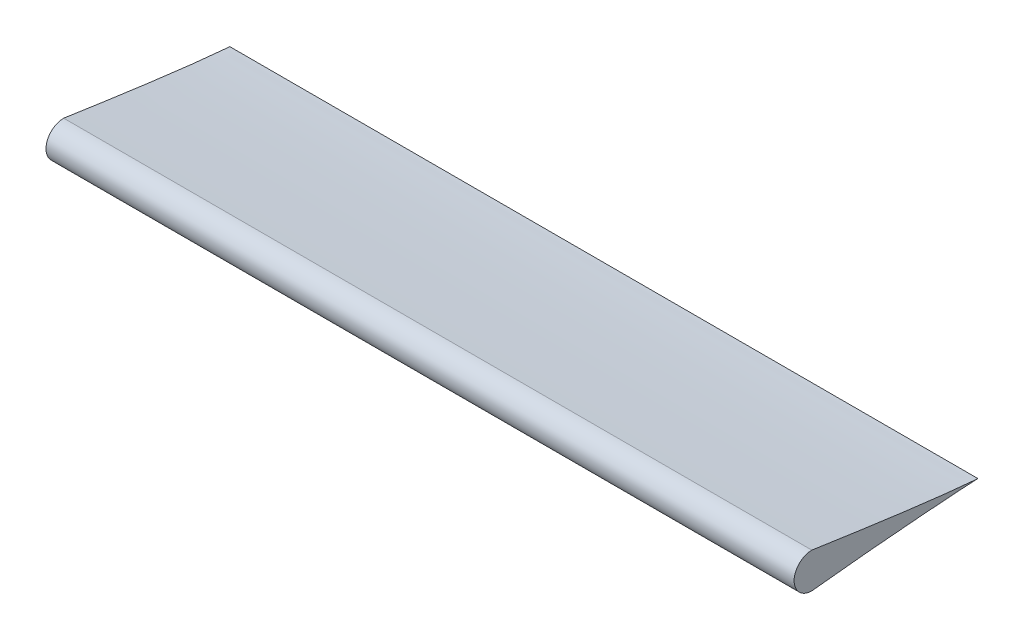
ISO-10303-21;
HEADER;
FILE_DESCRIPTION(('STEP AP214'),'2;1');
FILE_NAME('part.step','',(''),(''),'','','');
FILE_SCHEMA(('AUTOMOTIVE_DESIGN { 1 0 10303 214 1 1 1 1 }'));
ENDSEC;
DATA;
#1=APPLICATION_CONTEXT('core data for automotive mechanical design processes');
#2=APPLICATION_PROTOCOL_DEFINITION('international standard','automotive_design',2000,#1);
#3=PRODUCT_CONTEXT('',#1,'mechanical');
#4=PRODUCT('Part','Part','',(#3));
#5=PRODUCT_RELATED_PRODUCT_CATEGORY('part','',(#4));
#6=PRODUCT_DEFINITION_FORMATION('','',#4);
#7=PRODUCT_DEFINITION_CONTEXT('part definition',#1,'design');
#8=PRODUCT_DEFINITION('design','',#6,#7);
#9=PRODUCT_DEFINITION_SHAPE('','',#8);
#10=(LENGTH_UNIT() NAMED_UNIT(*) SI_UNIT(.MILLI.,.METRE.));
#11=(NAMED_UNIT(*) PLANE_ANGLE_UNIT() SI_UNIT($,.RADIAN.));
#12=(NAMED_UNIT(*) SI_UNIT($,.STERADIAN.) SOLID_ANGLE_UNIT());
#13=UNCERTAINTY_MEASURE_WITH_UNIT(LENGTH_MEASURE(1.E-05),#10,'distance_accuracy_value','');
#14=(GEOMETRIC_REPRESENTATION_CONTEXT(3) GLOBAL_UNCERTAINTY_ASSIGNED_CONTEXT((#13)) GLOBAL_UNIT_ASSIGNED_CONTEXT((#10,
#11,#12)) REPRESENTATION_CONTEXT('',''));
#15=CARTESIAN_POINT('',(0.,0.,0.));
#16=DIRECTION('',(0.,0.,1.));
#17=DIRECTION('',(1.,0.,0.));
#18=AXIS2_PLACEMENT_3D('',#15,#16,#17);
#19=CARTESIAN_POINT('',(1040.,5.86071638027729,-346.600000000002));
#20=CARTESIAN_POINT('',(1040.,5.86942153305407,-346.597852480933));
#21=CARTESIAN_POINT('',(1040.,5.95408700484373,-345.167167538133));
#22=CARTESIAN_POINT('',(1040.,6.12770380231326,-343.71030351356));
#23=CARTESIAN_POINT('',(1040.,6.4308186427241,-340.207816876405));
#24=CARTESIAN_POINT('',(1040.,6.87325921714055,-335.907670847587));
#25=CARTESIAN_POINT('',(1040.,7.49275086256784,-330.292953697324));
#26=CARTESIAN_POINT('',(1040.,8.27408445055139,-323.659553652556));
#27=CARTESIAN_POINT('',(1040.,9.24327014430082,-316.002511078225));
#28=CARTESIAN_POINT('',(1040.,10.3815705655345,-307.429551377501));
#29=CARTESIAN_POINT('',(1040.,11.6833030342218,-298.018680009203));
#30=CARTESIAN_POINT('',(1040.,13.1368804000073,-287.863702409179));
#31=CARTESIAN_POINT('',(1040.,14.7182033722859,-277.059643778127));
#32=CARTESIAN_POINT('',(1040.,16.4008254095122,-265.704765677718));
#33=CARTESIAN_POINT('',(1040.,18.1406788919493,-253.896097473474));
#34=CARTESIAN_POINT('',(1040.,19.9192377434932,-241.737250017814));
#35=CARTESIAN_POINT('',(1040.,21.6563318290564,-229.327440834419));
#36=CARTESIAN_POINT('',(1040.,23.3337080476178,-216.762528701424));
#37=CARTESIAN_POINT('',(1040.,24.7772271585557,-204.073884670746));
#38=CARTESIAN_POINT('',(1040.,25.9228413259878,-191.282522577714));
#39=CARTESIAN_POINT('',(1040.,26.8745966143026,-178.425425999593));
#40=CARTESIAN_POINT('',(1040.,27.5954369967736,-165.549012826765));
#41=CARTESIAN_POINT('',(1040.,28.088486879693,-152.725859519747));
#42=CARTESIAN_POINT('',(1040.,28.3788067662139,-140.023357060786));
#43=CARTESIAN_POINT('',(1040.,28.4385181896697,-127.510045631155));
#44=CARTESIAN_POINT('',(1040.,28.2957815085232,-115.254313713338));
#45=CARTESIAN_POINT('',(1040.,27.9345770933286,-103.323214561727));
#46=CARTESIAN_POINT('',(1040.,27.3774648805769,-91.7878334113468));
#47=CARTESIAN_POINT('',(1040.,26.6199481784094,-80.7121418120204));
#48=CARTESIAN_POINT('',(1040.,25.6837634702586,-70.1628154750461));
#49=CARTESIAN_POINT('',(1040.,24.5593112665133,-60.2034081504018));
#50=CARTESIAN_POINT('',(1040.,23.2663130962176,-50.8913221894429));
#51=CARTESIAN_POINT('',(1040.,21.7863228253272,-42.280845355484));
#52=CARTESIAN_POINT('',(1040.,20.1573279635737,-34.4120212721913));
#53=CARTESIAN_POINT('',(1040.,18.3357603863429,-27.3199916589574));
#54=CARTESIAN_POINT('',(1040.,16.321012042133,-21.0306334923619));
#55=CARTESIAN_POINT('',(1040.,14.2018530313748,-15.5314824382831));
#56=CARTESIAN_POINT('',(1040.,11.956924227719,-10.8536593210113));
#57=CARTESIAN_POINT('',(1040.,9.65350487933514,-7.00869240132422));
#58=CARTESIAN_POINT('',(1040.,7.32149117441311,-3.99127209384448));
#59=CARTESIAN_POINT('',(1040.,4.91734468115568,-1.82192325647609));
#60=CARTESIAN_POINT('',(1040.,2.58232434229011,-0.523442799864354));
#61=CARTESIAN_POINT('',(1040.,0.409759015467137,0.233627416068555));
#62=CARTESIAN_POINT('',(1040.,-1.75709273500441,-0.426579477063926));
#63=CARTESIAN_POINT('',(1040.,-3.19774833654451,-2.53791233705558));
#64=CARTESIAN_POINT('',(1040.,-4.65483807131872,-5.39211144626317));
#65=CARTESIAN_POINT('',(1040.,-6.05472613804292,-9.30647814844365));
#66=CARTESIAN_POINT('',(1040.,-7.37535584141202,-14.1602854101434));
#67=CARTESIAN_POINT('',(1040.,-8.59209450318427,-19.9552057462871));
#68=CARTESIAN_POINT('',(1040.,-9.67784910590047,-26.6510377888111));
#69=CARTESIAN_POINT('',(1040.,-10.6303869203227,-34.2149896306284));
#70=CARTESIAN_POINT('',(1040.,-11.4362358704925,-42.6095526598737));
#71=CARTESIAN_POINT('',(1040.,-12.0917115028124,-51.7866503013561));
#72=CARTESIAN_POINT('',(1040.,-12.6014398459628,-61.6964853282173));
#73=CARTESIAN_POINT('',(1040.,-12.9578854769251,-72.2808050911164));
#74=CARTESIAN_POINT('',(1040.,-13.1648826289751,-83.4794397444211));
#75=CARTESIAN_POINT('',(1040.,-13.2211833311955,-95.2244179207898));
#76=CARTESIAN_POINT('',(1040.,-13.132798440432,-107.445315636969));
#77=CARTESIAN_POINT('',(1040.,-12.9039422081063,-120.06718568759));
#78=CARTESIAN_POINT('',(1040.,-12.5386131752456,-133.010375763007));
#79=CARTESIAN_POINT('',(1040.,-12.0446708618454,-146.192016010977));
#80=CARTESIAN_POINT('',(1040.,-11.4143407457611,-159.52633158202));
#81=CARTESIAN_POINT('',(1040.,-10.6584041848465,-172.924472517881));
#82=CARTESIAN_POINT('',(1040.,-9.72862479746972,-186.316724917838));
#83=CARTESIAN_POINT('',(1040.,-8.59584787560963,-199.652839070497));
#84=CARTESIAN_POINT('',(1040.,-7.31292079951085,-212.898223931713));
#85=CARTESIAN_POINT('',(1040.,-5.91694220775768,-226.003657754342));
#86=CARTESIAN_POINT('',(1040.,-4.45292645217388,-238.897774799766));
#87=CARTESIAN_POINT('',(1040.,-2.98628782761956,-251.506843629765));
#88=CARTESIAN_POINT('',(1040.,-1.56237335714116,-263.735084655258));
#89=CARTESIAN_POINT('',(1040.,-0.237986920124444,-275.482068230199));
#90=CARTESIAN_POINT('',(1040.,0.967497871551481,-286.637141689727));
#91=CARTESIAN_POINT('',(1040.,2.03372814092395,-297.094147692606));
#92=CARTESIAN_POINT('',(1040.,2.94760216572376,-306.753882210194));
#93=CARTESIAN_POINT('',(1040.,3.71094189693194,-315.518201790493));
#94=CARTESIAN_POINT('',(1040.,4.33761076632516,-323.308156110828));
#95=CARTESIAN_POINT('',(1040.,4.82578782510334,-330.021729474099));
#96=CARTESIAN_POINT('',(1040.,5.21956178896954,-335.69003557838));
#97=CARTESIAN_POINT('',(1040.,5.55182594115478,-340.042163058898));
#98=CARTESIAN_POINT('',(1040.,5.75757542524663,-343.623905570646));
#99=CARTESIAN_POINT('',(1040.,5.87005572151078,-345.115045904188));
#100=CARTESIAN_POINT('',(1040.,5.85182687726851,-346.602192997381));
#101=CARTESIAN_POINT('',(1040.,5.86071638027729,-346.600000000002));
#102=B_SPLINE_CURVE_WITH_KNOTS('',3,(#19,#20,#21,#22,#23,#24,#25,#26,#27,#28,#29,#30,#31,#32,
#33,#34,#35,#36,#37,#38,#39,#40,#41,#42,#43,#44,#45,#46,#47,#48,#49,#50,#51,#52,#53,#54,#55,#56,
#57,#58,#59,#60,#61,#62,#63,#64,#65,#66,#67,#68,#69,#70,#71,#72,#73,#74,#75,#76,#77,#78,#79,#80,
#81,#82,#83,#84,#85,#86,#87,#88,#89,#90,#91,#92,#93,#94,#95,#96,#97,#98,#99,#100,#101),
.UNSPECIFIED.,.T.,.F.,(4,1,1,1,1,1,1,1,1,1,1,1,1,1,1,1,1,1,1,1,1,1,1,1,1,1,1,1,1,1,1,1,1,1,1,1,
1,1,1,1,1,1,1,1,1,1,1,1,1,1,1,1,1,1,1,1,1,1,1,1,1,1,1,1,1,1,1,1,1,1,1,1,1,1,1,1,1,1,1,1,4),(0.,
0.000971237958935089,0.00379550488941406,0.00838889713311412,0.0147108585341679,
0.0226780451151255,0.0321935893654122,0.0431578374772158,0.0554477635765267,0.0689450810748732,
0.0835209743295518,0.0990345049396833,0.115338149300278,0.132292378261073,0.149748787287016,
0.167548160817062,0.185533000847794,0.203606824322396,0.221802152219981,0.240094780419079,
0.258381325545334,0.276593840485898,0.294615696320151,0.312363136598153,0.329758285552068,
0.34668867666744,0.363076304230722,0.378823915995178,0.393853850968574,0.408070676422894,
0.421404123740081,0.433792847882556,0.445184773052429,0.455537591190034,0.464887425285465,
0.473229998593558,0.480557633281548,0.486906623799577,0.492238034051424,0.496718364977629,
0.500526341599145,0.503606091199367,0.506177592628953,0.509478573363382,0.514052138731787,
0.519911011985978,0.527046393100711,0.535434514860353,0.545049400456516,0.555862282514593,
0.56781964692456,0.58087606000333,0.594950040868561,0.609977749598367,0.625870112949949,
0.642537246695213,0.659878939874303,0.677794441934522,0.696172799529494,0.714892973853184,
0.733838964579521,0.752890035469179,0.771908418749841,0.790874705845988,0.809754599599678,
0.828447710464764,0.846871330730811,0.864890849052298,0.882382263972322,0.89917761398861,
0.915117479075331,0.930053399369896,0.943838005379903,0.956340240690094,0.967439356026097,
0.977019226998307,0.985009700423928,0.991382470548144,0.996091139759218,0.999008193999625,1.),.UNSPECIFIED.);
#103=DIRECTION('',(-1.,0.,0.));
#104=VECTOR('',#103,1.);
#105=SURFACE_OF_LINEAR_EXTRUSION('',#102,#104);
#106=DIRECTION('',(0.,1.,0.));
#107=VECTOR('',#106,1.);
#108=CARTESIAN_POINT('',(728.,-13.2211833311954,-346.600009514084));
#109=LINE('',#108,#107);
#110=CARTESIAN_POINT('',(728.,5.86063879772081,-346.600009514084));
#111=VERTEX_POINT('',#110);
#112=CARTESIAN_POINT('',(728.,5.86071638027724,-346.600009514084));
#113=VERTEX_POINT('',#112);
#114=EDGE_CURVE('E135',#111,#113,#109,.T.);
#115=ORIENTED_EDGE('',*,*,#114,.T.);
#116=CARTESIAN_POINT('',(728.,5.86071638027733,-346.600000000001));
#117=CARTESIAN_POINT('',(728.,5.86942153305412,-346.597852480932));
#118=CARTESIAN_POINT('',(728.,5.95408700484373,-345.167167538133));
#119=CARTESIAN_POINT('',(728.,6.12770380231326,-343.71030351356));
#120=CARTESIAN_POINT('',(728.,6.43081864272416,-340.207816876404));
#121=CARTESIAN_POINT('',(728.,6.87325921714066,-335.907670847587));
#122=CARTESIAN_POINT('',(728.,7.49275086256784,-330.292953697323));
#123=CARTESIAN_POINT('',(728.,8.27408445055139,-323.659553652556));
#124=CARTESIAN_POINT('',(728.,9.24327014430082,-316.002511078225));
#125=CARTESIAN_POINT('',(728.,10.3815705655344,-307.429551377501));
#126=CARTESIAN_POINT('',(728.,11.6833030342218,-298.018680009203));
#127=CARTESIAN_POINT('',(728.,13.1368804000073,-287.863702409179));
#128=CARTESIAN_POINT('',(728.,14.7182033722859,-277.059643778127));
#129=CARTESIAN_POINT('',(728.,16.4008254095121,-265.704765677719));
#130=CARTESIAN_POINT('',(728.,18.1406788919493,-253.896097473474));
#131=CARTESIAN_POINT('',(728.,19.9192377434932,-241.737250017814));
#132=CARTESIAN_POINT('',(728.,21.6563318290564,-229.327440834419));
#133=CARTESIAN_POINT('',(728.,23.3337080476178,-216.762528701424));
#134=CARTESIAN_POINT('',(728.,24.7772271585557,-204.073884670746));
#135=CARTESIAN_POINT('',(728.,25.9228413259878,-191.282522577713));
#136=CARTESIAN_POINT('',(728.,26.8745966143026,-178.425425999593));
#137=CARTESIAN_POINT('',(728.,27.5954369967736,-165.549012826765));
#138=CARTESIAN_POINT('',(728.,28.088486879693,-152.725859519747));
#139=CARTESIAN_POINT('',(728.,28.3788067662139,-140.023357060786));
#140=CARTESIAN_POINT('',(728.,28.4385181896697,-127.510045631155));
#141=CARTESIAN_POINT('',(728.,28.2957815085232,-115.254313713338));
#142=CARTESIAN_POINT('',(728.,27.9345770933285,-103.323214561727));
#143=CARTESIAN_POINT('',(728.,27.377464880577,-91.7878334113469));
#144=CARTESIAN_POINT('',(728.,26.6199481784094,-80.7121418120204));
#145=CARTESIAN_POINT('',(728.,25.6837634702586,-70.1628154750462));
#146=CARTESIAN_POINT('',(728.,24.5593112665133,-60.2034081504018));
#147=CARTESIAN_POINT('',(728.,23.2663130962177,-50.8913221894429));
#148=CARTESIAN_POINT('',(728.,21.7863228253272,-42.2808453554841));
#149=CARTESIAN_POINT('',(728.,20.1573279635737,-34.4120212721913));
#150=CARTESIAN_POINT('',(728.,18.3357603863429,-27.3199916589574));
#151=CARTESIAN_POINT('',(728.,16.321012042133,-21.030633492362));
#152=CARTESIAN_POINT('',(728.,14.2018530313748,-15.5314824382831));
#153=CARTESIAN_POINT('',(728.,11.956924227719,-10.8536593210112));
#154=CARTESIAN_POINT('',(728.,9.65350487933514,-7.00869240132423));
#155=CARTESIAN_POINT('',(728.,7.32149117441311,-3.99127209384453));
#156=CARTESIAN_POINT('',(728.,4.91734468115568,-1.82192325647618));
#157=CARTESIAN_POINT('',(728.,2.58232434229011,-0.523442799864188));
#158=CARTESIAN_POINT('',(728.,0.409759015467137,0.233627416068444));
#159=CARTESIAN_POINT('',(728.,-1.75709273500441,-0.42657947706401));
#160=CARTESIAN_POINT('',(728.,-3.19774833654451,-2.5379123370555));
#161=CARTESIAN_POINT('',(728.,-4.65483807131872,-5.39211144626328));
#162=CARTESIAN_POINT('',(728.,-6.05472613804292,-9.30647814844361));
#163=CARTESIAN_POINT('',(728.,-7.37535584141202,-14.1602854101435));
#164=CARTESIAN_POINT('',(728.,-8.59209450318427,-19.955205746287));
#165=CARTESIAN_POINT('',(728.,-9.67784910590053,-26.6510377888111));
#166=CARTESIAN_POINT('',(728.,-10.6303869203228,-34.2149896306284));
#167=CARTESIAN_POINT('',(728.,-11.4362358704925,-42.6095526598738));
#168=CARTESIAN_POINT('',(728.,-12.0917115028125,-51.786650301356));
#169=CARTESIAN_POINT('',(728.,-12.6014398459628,-61.6964853282173));
#170=CARTESIAN_POINT('',(728.,-12.9578854769251,-72.2808050911164));
#171=CARTESIAN_POINT('',(728.,-13.1648826289752,-83.4794397444212));
#172=CARTESIAN_POINT('',(728.,-13.2211833311956,-95.2244179207898));
#173=CARTESIAN_POINT('',(728.,-13.132798440432,-107.44531563697));
#174=CARTESIAN_POINT('',(728.,-12.9039422081063,-120.06718568759));
#175=CARTESIAN_POINT('',(728.,-12.5386131752457,-133.010375763007));
#176=CARTESIAN_POINT('',(728.,-12.0446708618455,-146.192016010977));
#177=CARTESIAN_POINT('',(728.,-11.4143407457611,-159.52633158202));
#178=CARTESIAN_POINT('',(728.,-10.6584041848466,-172.924472517881));
#179=CARTESIAN_POINT('',(728.,-9.72862479746972,-186.316724917838));
#180=CARTESIAN_POINT('',(728.,-8.59584787560969,-199.652839070497));
#181=CARTESIAN_POINT('',(728.,-7.3129207995109,-212.898223931713));
#182=CARTESIAN_POINT('',(728.,-5.91694220775768,-226.003657754342));
#183=CARTESIAN_POINT('',(728.,-4.45292645217388,-238.897774799766));
#184=CARTESIAN_POINT('',(728.,-2.98628782761956,-251.506843629765));
#185=CARTESIAN_POINT('',(728.,-1.56237335714116,-263.735084655258));
#186=CARTESIAN_POINT('',(728.,-0.2379869201245,-275.482068230199));
#187=CARTESIAN_POINT('',(728.,0.967497871551481,-286.637141689727));
#188=CARTESIAN_POINT('',(728.,2.0337281409239,-297.094147692606));
#189=CARTESIAN_POINT('',(728.,2.94760216572376,-306.753882210194));
#190=CARTESIAN_POINT('',(728.,3.71094189693189,-315.518201790493));
#191=CARTESIAN_POINT('',(728.,4.33761076632516,-323.308156110829));
#192=CARTESIAN_POINT('',(728.,4.82578782510334,-330.021729474098));
#193=CARTESIAN_POINT('',(728.,5.2195617889696,-335.69003557838));
#194=CARTESIAN_POINT('',(728.,5.55182594115478,-340.042163058898));
#195=CARTESIAN_POINT('',(728.,5.75757542524663,-343.623905570646));
#196=CARTESIAN_POINT('',(728.,5.87005572151078,-345.115045904188));
#197=CARTESIAN_POINT('',(728.,5.85182687726855,-346.60219299738));
#198=CARTESIAN_POINT('',(728.,5.86071638027733,-346.600000000001));
#199=B_SPLINE_CURVE_WITH_KNOTS('',3,(#116,#117,#118,#119,#120,#121,#122,#123,#124,#125,#126,
#127,#128,#129,#130,#131,#132,#133,#134,#135,#136,#137,#138,#139,#140,#141,#142,#143,#144,#145,
#146,#147,#148,#149,#150,#151,#152,#153,#154,#155,#156,#157,#158,#159,#160,#161,#162,#163,#164,
#165,#166,#167,#168,#169,#170,#171,#172,#173,#174,#175,#176,#177,#178,#179,#180,#181,#182,#183,
#184,#185,#186,#187,#188,#189,#190,#191,#192,#193,#194,#195,#196,#197,#198),.UNSPECIFIED.,.T.,
.F.,(4,1,1,1,1,1,1,1,1,1,1,1,1,1,1,1,1,1,1,1,1,1,1,1,1,1,1,1,1,1,1,1,1,1,1,1,1,1,1,1,1,1,1,1,1,
1,1,1,1,1,1,1,1,1,1,1,1,1,1,1,1,1,1,1,1,1,1,1,1,1,1,1,1,1,1,1,1,1,1,1,4),(0.,
0.000971237958935089,0.00379550488941406,0.00838889713311412,0.0147108585341679,
0.0226780451151255,0.0321935893654122,0.0431578374772158,0.0554477635765267,0.0689450810748732,
0.0835209743295518,0.0990345049396833,0.115338149300278,0.132292378261073,0.149748787287016,
0.167548160817062,0.185533000847794,0.203606824322396,0.221802152219981,0.240094780419079,
0.258381325545334,0.276593840485898,0.294615696320151,0.312363136598153,0.329758285552068,
0.34668867666744,0.363076304230722,0.378823915995178,0.393853850968574,0.408070676422894,
0.421404123740081,0.433792847882556,0.445184773052429,0.455537591190034,0.464887425285465,
0.473229998593558,0.480557633281548,0.486906623799577,0.492238034051424,0.496718364977629,
0.500526341599145,0.503606091199367,0.506177592628953,0.509478573363382,0.514052138731787,
0.519911011985978,0.527046393100711,0.535434514860353,0.545049400456516,0.555862282514593,
0.56781964692456,0.58087606000333,0.594950040868561,0.609977749598367,0.625870112949949,
0.642537246695213,0.659878939874303,0.677794441934522,0.696172799529494,0.714892973853184,
0.733838964579521,0.752890035469179,0.771908418749841,0.790874705845988,0.809754599599678,
0.828447710464764,0.846871330730811,0.864890849052298,0.882382263972322,0.89917761398861,
0.915117479075331,0.930053399369896,0.943838005379903,0.956340240690094,0.967439356026097,
0.977019226998307,0.985009700423928,0.991382470548144,0.996091139759218,0.999008193999625,1.),.UNSPECIFIED.);
#200=CARTESIAN_POINT('',(728.,14.6891266400672,-277.280000000001));
#201=VERTEX_POINT('',#200);
#202=EDGE_CURVE('E138',#113,#201,#199,.T.);
#203=ORIENTED_EDGE('',*,*,#202,.T.);
#204=DIRECTION('',(1.,0.,0.));
#205=VECTOR('',#204,1.);
#206=CARTESIAN_POINT('',(728.,14.6891266400672,-277.280000000001));
#207=LINE('',#206,#205);
#208=CARTESIAN_POINT('',(1040.,14.6891266400672,-277.280000000001));
#209=VERTEX_POINT('',#208);
#210=EDGE_CURVE('E160',#201,#209,#207,.T.);
#211=ORIENTED_EDGE('',*,*,#210,.T.);
#212=CARTESIAN_POINT('',(1040.,-0.049074166254548,-277.280000000001));
#213=VERTEX_POINT('',#212);
#214=EDGE_CURVE('E15',#213,#209,#102,.T.);
#215=ORIENTED_EDGE('',*,*,#214,.F.);
#216=DIRECTION('',(1.,0.,0.));
#217=VECTOR('',#216,1.);
#218=CARTESIAN_POINT('',(728.,-0.0490741662546035,-277.280000000001));
#219=LINE('',#218,#217);
#220=CARTESIAN_POINT('',(728.,-0.0490741662546035,-277.280000000001));
#221=VERTEX_POINT('',#220);
#222=EDGE_CURVE('E111',#221,#213,#219,.T.);
#223=ORIENTED_EDGE('',*,*,#222,.F.);
#224=EDGE_CURVE('E125',#221,#111,#199,.T.);
#225=ORIENTED_EDGE('',*,*,#224,.T.);
#226=EDGE_LOOP('',(#115,#203,#211,#215,#223,#225));
#227=FACE_BOUND('',#226,.T.);
#228=ADVANCED_FACE('F100',(#227),#105,.F.);
#229=CARTESIAN_POINT('',(1040.,2.72423800782384,-0.666894321440265));
#230=DIRECTION('',(-1.,0.,0.));
#231=DIRECTION('',(0.,0.,1.));
#232=AXIS2_PLACEMENT_3D('',#229,#230,#231);
#233=PLANE('',#232);
#234=CARTESIAN_POINT('',(1040.,7.32002623690631,-277.280000000001));
#235=DIRECTION('',(1.,0.,0.));
#236=DIRECTION('',(0.,0.,-1.));
#237=AXIS2_PLACEMENT_3D('',#234,#235,#236);
#238=CIRCLE('',#237,7.36910040316079);
#239=EDGE_CURVE('E146',#209,#213,#238,.T.);
#240=ORIENTED_EDGE('',*,*,#239,.T.);
#241=ORIENTED_EDGE('',*,*,#214,.T.);
#242=EDGE_LOOP('',(#240,#241));
#243=FACE_BOUND('',#242,.T.);
#244=ADVANCED_FACE('F168',(#243),#233,.F.);
#245=CARTESIAN_POINT('',(728.,7.32002623690625,-277.280000000001));
#246=DIRECTION('',(1.,0.,0.));
#247=DIRECTION('',(0.,0.,-1.));
#248=AXIS2_PLACEMENT_3D('',#245,#246,#247);
#249=CYLINDRICAL_SURFACE('',#248,7.36910040316079);
#250=ORIENTED_EDGE('',*,*,#239,.F.);
#251=ORIENTED_EDGE('',*,*,#210,.F.);
#252=CARTESIAN_POINT('',(728.,7.32002623690625,-277.280000000001));
#253=DIRECTION('',(1.,0.,0.));
#254=DIRECTION('',(0.,0.,-1.));
#255=AXIS2_PLACEMENT_3D('',#252,#253,#254);
#256=CIRCLE('',#255,7.36910040316079);
#257=EDGE_CURVE('E157',#201,#221,#256,.T.);
#258=ORIENTED_EDGE('',*,*,#257,.T.);
#259=ORIENTED_EDGE('',*,*,#222,.T.);
#260=EDGE_LOOP('',(#250,#251,#258,#259));
#261=FACE_BOUND('',#260,.T.);
#262=ADVANCED_FACE('F169',(#261),#249,.T.);
#263=CARTESIAN_POINT('',(728.,-13.2211833311955,0.0165959801472215));
#264=DIRECTION('',(1.,0.,0.));
#265=DIRECTION('',(0.,0.,-1.));
#266=AXIS2_PLACEMENT_3D('',#263,#264,#265);
#267=PLANE('',#266);
#268=ORIENTED_EDGE('',*,*,#114,.F.);
#269=ORIENTED_EDGE('',*,*,#224,.F.);
#270=ORIENTED_EDGE('',*,*,#257,.F.);
#271=ORIENTED_EDGE('',*,*,#202,.F.);
#272=EDGE_LOOP('',(#268,#269,#270,#271));
#273=FACE_BOUND('',#272,.T.);
#274=ADVANCED_FACE('F136',(#273),#267,.F.);
#275=CLOSED_SHELL('',(#228,#244,#262,#274));
#276=MANIFOLD_SOLID_BREP('B2',#275);
#277=ADVANCED_BREP_SHAPE_REPRESENTATION('',(#18,#276),#14);
#278=SHAPE_DEFINITION_REPRESENTATION(#9,#277);
ENDSEC;
END-ISO-10303-21;
